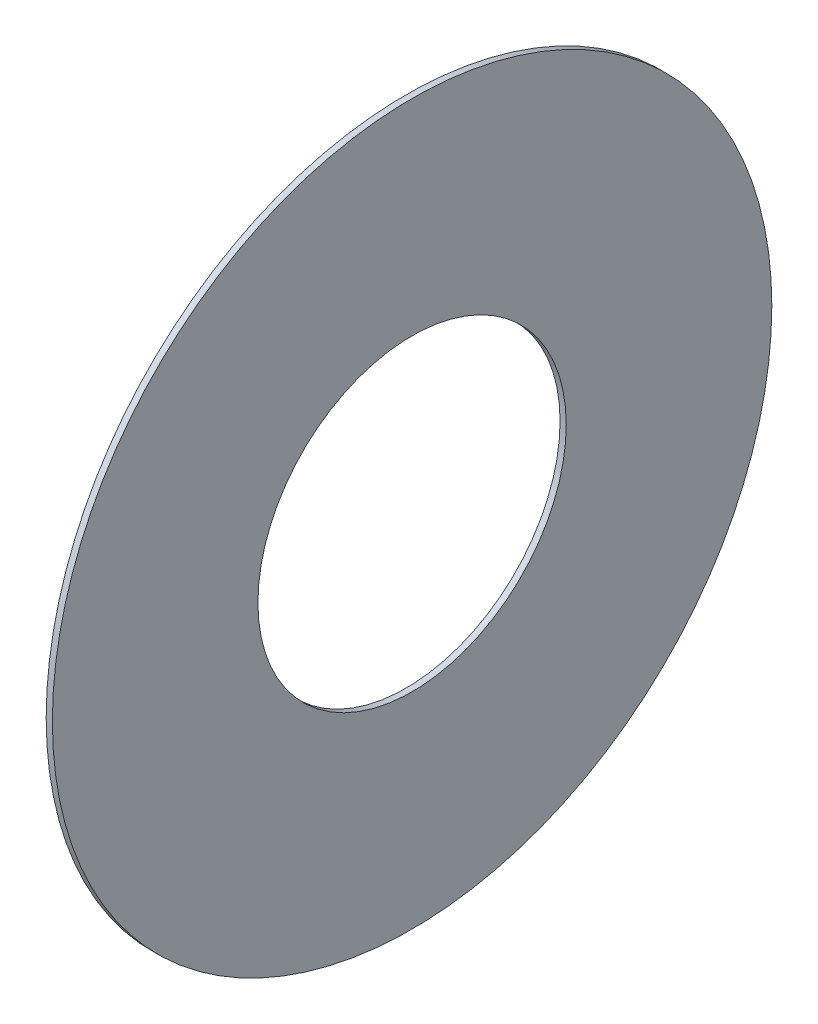
ISO-10303-21;
HEADER;
FILE_DESCRIPTION(('STEP AP214'),'2;1');
FILE_NAME('part.step','',(''),(''),'','','');
FILE_SCHEMA(('AUTOMOTIVE_DESIGN { 1 0 10303 214 1 1 1 1 }'));
ENDSEC;
DATA;
#1=APPLICATION_CONTEXT('core data for automotive mechanical design processes');
#2=APPLICATION_PROTOCOL_DEFINITION('international standard','automotive_design',2000,#1);
#3=PRODUCT_CONTEXT('',#1,'mechanical');
#4=PRODUCT('Part','Part','',(#3));
#5=PRODUCT_RELATED_PRODUCT_CATEGORY('part','',(#4));
#6=PRODUCT_DEFINITION_FORMATION('','',#4);
#7=PRODUCT_DEFINITION_CONTEXT('part definition',#1,'design');
#8=PRODUCT_DEFINITION('design','',#6,#7);
#9=PRODUCT_DEFINITION_SHAPE('','',#8);
#10=(LENGTH_UNIT() NAMED_UNIT(*) SI_UNIT(.MILLI.,.METRE.));
#11=(NAMED_UNIT(*) PLANE_ANGLE_UNIT() SI_UNIT($,.RADIAN.));
#12=(NAMED_UNIT(*) SI_UNIT($,.STERADIAN.) SOLID_ANGLE_UNIT());
#13=UNCERTAINTY_MEASURE_WITH_UNIT(LENGTH_MEASURE(1.E-05),#10,'distance_accuracy_value','');
#14=(GEOMETRIC_REPRESENTATION_CONTEXT(3) GLOBAL_UNCERTAINTY_ASSIGNED_CONTEXT((#13)) GLOBAL_UNIT_ASSIGNED_CONTEXT((#10,
#11,#12)) REPRESENTATION_CONTEXT('',''));
#15=CARTESIAN_POINT('',(0.,0.,0.));
#16=DIRECTION('',(0.,0.,1.));
#17=DIRECTION('',(1.,0.,0.));
#18=AXIS2_PLACEMENT_3D('',#15,#16,#17);
#19=CARTESIAN_POINT('',(0.8382,0.,0.));
#20=DIRECTION('',(1.,0.,0.));
#21=DIRECTION('',(0.,0.,-1.));
#22=AXIS2_PLACEMENT_3D('',#19,#20,#21);
#23=PLANE('',#22);
#24=CARTESIAN_POINT('',(0.8382,0.,0.));
#25=DIRECTION('',(1.,0.,0.));
#26=DIRECTION('',(0.,0.,-1.));
#27=AXIS2_PLACEMENT_3D('',#24,#25,#26);
#28=CIRCLE('',#27,48.895);
#29=CARTESIAN_POINT('',(0.8382,0.,-48.895));
#30=VERTEX_POINT('',#29);
#31=EDGE_CURVE('E10',#30,#30,#28,.T.);
#32=ORIENTED_EDGE('',*,*,#31,.T.);
#33=EDGE_LOOP('',(#32));
#34=FACE_BOUND('',#33,.T.);
#35=CARTESIAN_POINT('',(0.8382,0.,0.));
#36=DIRECTION('',(1.,0.,0.));
#37=DIRECTION('',(0.,0.,-1.));
#38=AXIS2_PLACEMENT_3D('',#35,#36,#37);
#39=CIRCLE('',#38,20.955);
#40=CARTESIAN_POINT('',(0.8382,0.,-20.955));
#41=VERTEX_POINT('',#40);
#42=EDGE_CURVE('E52',#41,#41,#39,.T.);
#43=ORIENTED_EDGE('',*,*,#42,.F.);
#44=EDGE_LOOP('',(#43));
#45=FACE_BOUND('',#44,.T.);
#46=ADVANCED_FACE('F41',(#34,#45),#23,.T.);
#47=CARTESIAN_POINT('',(0.,0.,0.));
#48=DIRECTION('',(1.,0.,0.));
#49=DIRECTION('',(0.,0.,-1.));
#50=AXIS2_PLACEMENT_3D('',#47,#48,#49);
#51=PLANE('',#50);
#52=CARTESIAN_POINT('',(0.,0.,0.));
#53=DIRECTION('',(1.,0.,0.));
#54=DIRECTION('',(0.,0.,-1.));
#55=AXIS2_PLACEMENT_3D('',#52,#53,#54);
#56=CIRCLE('',#55,48.895);
#57=CARTESIAN_POINT('',(0.,0.,-48.895));
#58=VERTEX_POINT('',#57);
#59=EDGE_CURVE('E45',#58,#58,#56,.T.);
#60=ORIENTED_EDGE('',*,*,#59,.F.);
#61=EDGE_LOOP('',(#60));
#62=FACE_BOUND('',#61,.T.);
#63=CARTESIAN_POINT('',(0.,0.,0.));
#64=DIRECTION('',(1.,0.,0.));
#65=DIRECTION('',(0.,0.,-1.));
#66=AXIS2_PLACEMENT_3D('',#63,#64,#65);
#67=CIRCLE('',#66,20.955);
#68=CARTESIAN_POINT('',(0.,0.,-20.955));
#69=VERTEX_POINT('',#68);
#70=EDGE_CURVE('E54',#69,#69,#67,.T.);
#71=ORIENTED_EDGE('',*,*,#70,.T.);
#72=EDGE_LOOP('',(#71));
#73=FACE_BOUND('',#72,.T.);
#74=ADVANCED_FACE('F64',(#62,#73),#51,.F.);
#75=CARTESIAN_POINT('',(0.8382,0.,0.));
#76=DIRECTION('',(-1.,0.,0.));
#77=DIRECTION('',(0.,0.,1.));
#78=AXIS2_PLACEMENT_3D('',#75,#76,#77);
#79=CYLINDRICAL_SURFACE('',#78,48.895);
#80=ORIENTED_EDGE('',*,*,#31,.F.);
#81=EDGE_LOOP('',(#80));
#82=FACE_BOUND('',#81,.T.);
#83=ORIENTED_EDGE('',*,*,#59,.T.);
#84=EDGE_LOOP('',(#83));
#85=FACE_BOUND('',#84,.T.);
#86=ADVANCED_FACE('F43',(#82,#85),#79,.T.);
#87=CARTESIAN_POINT('',(0.8382,0.,0.));
#88=DIRECTION('',(-1.,0.,0.));
#89=DIRECTION('',(0.,0.,1.));
#90=AXIS2_PLACEMENT_3D('',#87,#88,#89);
#91=CYLINDRICAL_SURFACE('',#90,20.955);
#92=ORIENTED_EDGE('',*,*,#42,.T.);
#93=EDGE_LOOP('',(#92));
#94=FACE_BOUND('',#93,.T.);
#95=ORIENTED_EDGE('',*,*,#70,.F.);
#96=EDGE_LOOP('',(#95));
#97=FACE_BOUND('',#96,.T.);
#98=ADVANCED_FACE('F60',(#94,#97),#91,.F.);
#99=CLOSED_SHELL('',(#46,#74,#86,#98));
#100=MANIFOLD_SOLID_BREP('B2',#99);
#101=ADVANCED_BREP_SHAPE_REPRESENTATION('',(#18,#100),#14);
#102=SHAPE_DEFINITION_REPRESENTATION(#9,#101);
ENDSEC;
END-ISO-10303-21;
